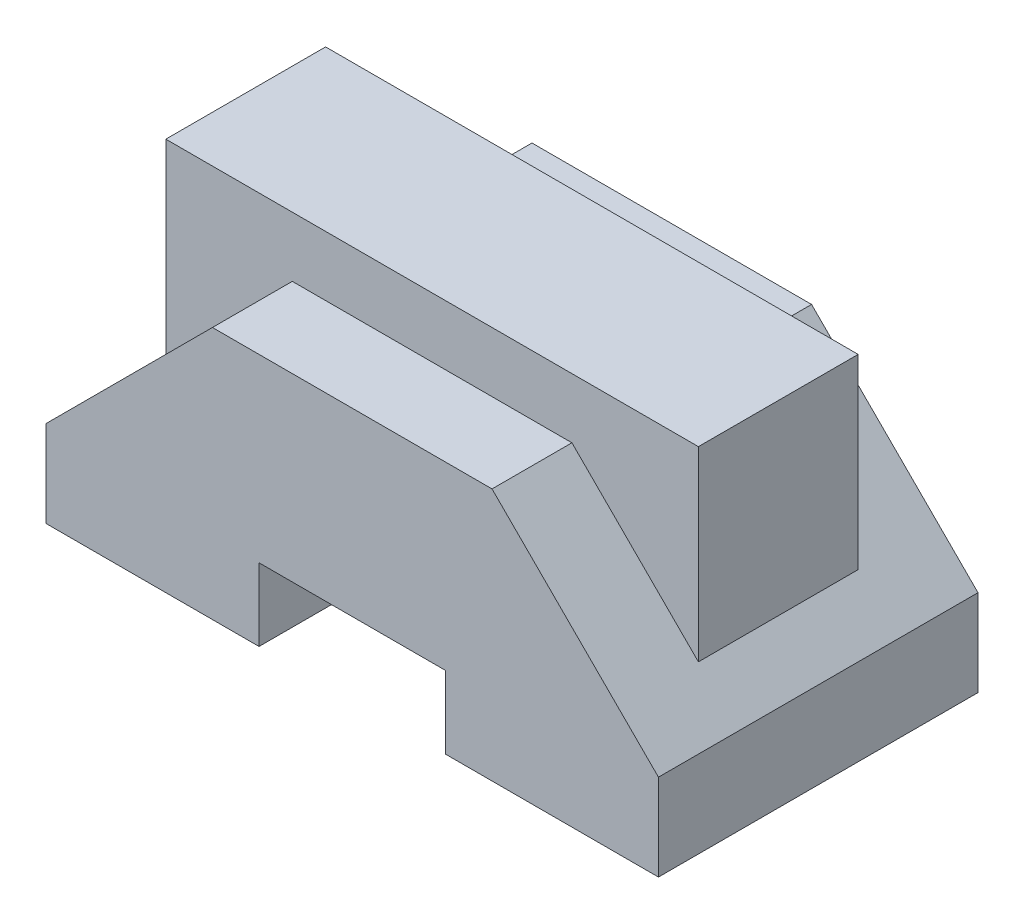
ISO-10303-21;
HEADER;
FILE_DESCRIPTION(('STEP AP214'),'2;1');
FILE_NAME('part.step','',(''),(''),'','','');
FILE_SCHEMA(('AUTOMOTIVE_DESIGN { 1 0 10303 214 1 1 1 1 }'));
ENDSEC;
DATA;
#1=APPLICATION_CONTEXT('core data for automotive mechanical design processes');
#2=APPLICATION_PROTOCOL_DEFINITION('international standard','automotive_design',2000,#1);
#3=PRODUCT_CONTEXT('',#1,'mechanical');
#4=PRODUCT('Part','Part','',(#3));
#5=PRODUCT_RELATED_PRODUCT_CATEGORY('part','',(#4));
#6=PRODUCT_DEFINITION_FORMATION('','',#4);
#7=PRODUCT_DEFINITION_CONTEXT('part definition',#1,'design');
#8=PRODUCT_DEFINITION('design','',#6,#7);
#9=PRODUCT_DEFINITION_SHAPE('','',#8);
#10=(LENGTH_UNIT() NAMED_UNIT(*) SI_UNIT(.MILLI.,.METRE.));
#11=(NAMED_UNIT(*) PLANE_ANGLE_UNIT() SI_UNIT($,.RADIAN.));
#12=(NAMED_UNIT(*) SI_UNIT($,.STERADIAN.) SOLID_ANGLE_UNIT());
#13=UNCERTAINTY_MEASURE_WITH_UNIT(LENGTH_MEASURE(1.E-05),#10,'distance_accuracy_value','');
#14=(GEOMETRIC_REPRESENTATION_CONTEXT(3) GLOBAL_UNCERTAINTY_ASSIGNED_CONTEXT((#13)) GLOBAL_UNIT_ASSIGNED_CONTEXT((#10,
#11,#12)) REPRESENTATION_CONTEXT('',''));
#15=CARTESIAN_POINT('',(0.,0.,0.));
#16=DIRECTION('',(0.,0.,1.));
#17=DIRECTION('',(1.,0.,0.));
#18=AXIS2_PLACEMENT_3D('',#15,#16,#17);
#19=CARTESIAN_POINT('',(0.,38.,24.));
#20=DIRECTION('',(0.,-1.,0.));
#21=DIRECTION('',(0.,0.,-1.));
#22=AXIS2_PLACEMENT_3D('',#19,#20,#21);
#23=PLANE('',#22);
#24=DIRECTION('',(0.,0.,-1.));
#25=VECTOR('',#24,1.);
#26=CARTESIAN_POINT('',(21.,38.,24.));
#27=LINE('',#26,#25);
#28=CARTESIAN_POINT('',(21.,38.,24.));
#29=VERTEX_POINT('',#28);
#30=CARTESIAN_POINT('',(21.,38.,12.));
#31=VERTEX_POINT('',#30);
#32=EDGE_CURVE('E241',#29,#31,#27,.T.);
#33=ORIENTED_EDGE('',*,*,#32,.T.);
#34=DIRECTION('',(-1.,0.,0.));
#35=VECTOR('',#34,1.);
#36=CARTESIAN_POINT('',(0.,38.,12.));
#37=LINE('',#36,#35);
#38=CARTESIAN_POINT('',(-21.,38.,12.));
#39=VERTEX_POINT('',#38);
#40=EDGE_CURVE('E178',#31,#39,#37,.T.);
#41=ORIENTED_EDGE('',*,*,#40,.T.);
#42=DIRECTION('',(0.,0.,-1.));
#43=VECTOR('',#42,1.);
#44=CARTESIAN_POINT('',(-21.,38.,24.));
#45=LINE('',#44,#43);
#46=CARTESIAN_POINT('',(-21.,38.,24.));
#47=VERTEX_POINT('',#46);
#48=EDGE_CURVE('E237',#47,#39,#45,.T.);
#49=ORIENTED_EDGE('',*,*,#48,.F.);
#50=DIRECTION('',(-1.,0.,0.));
#51=VECTOR('',#50,1.);
#52=CARTESIAN_POINT('',(0.,38.,24.));
#53=LINE('',#52,#51);
#54=EDGE_CURVE('E200',#29,#47,#53,.T.);
#55=ORIENTED_EDGE('',*,*,#54,.F.);
#56=EDGE_LOOP('',(#33,#41,#49,#55));
#57=FACE_BOUND('',#56,.T.);
#58=ADVANCED_FACE('F33',(#57),#23,.F.);
#59=CARTESIAN_POINT('',(0.,0.,24.));
#60=DIRECTION('',(0.,-1.,0.));
#61=DIRECTION('',(1.,0.,0.));
#62=AXIS2_PLACEMENT_3D('',#59,#60,#61);
#63=PLANE('',#62);
#64=DIRECTION('',(-1.,0.,0.));
#65=VECTOR('',#64,1.);
#66=CARTESIAN_POINT('',(0.,0.,-24.));
#67=LINE('',#66,#65);
#68=CARTESIAN_POINT('',(-14.,0.,-24.));
#69=VERTEX_POINT('',#68);
#70=CARTESIAN_POINT('',(-46.,0.,-24.));
#71=VERTEX_POINT('',#70);
#72=EDGE_CURVE('E182',#69,#71,#67,.T.);
#73=ORIENTED_EDGE('',*,*,#72,.F.);
#74=DIRECTION('',(0.,0.,-1.));
#75=VECTOR('',#74,1.);
#76=CARTESIAN_POINT('',(-14.,0.,24.));
#77=LINE('',#76,#75);
#78=CARTESIAN_POINT('',(-14.,0.,24.));
#79=VERTEX_POINT('',#78);
#80=EDGE_CURVE('E258',#79,#69,#77,.T.);
#81=ORIENTED_EDGE('',*,*,#80,.F.);
#82=DIRECTION('',(-1.,0.,0.));
#83=VECTOR('',#82,1.);
#84=CARTESIAN_POINT('',(0.,0.,24.));
#85=LINE('',#84,#83);
#86=CARTESIAN_POINT('',(-46.,0.,24.));
#87=VERTEX_POINT('',#86);
#88=EDGE_CURVE('E183',#79,#87,#85,.T.);
#89=ORIENTED_EDGE('',*,*,#88,.T.);
#90=DIRECTION('',(0.,0.,-1.));
#91=VECTOR('',#90,1.);
#92=CARTESIAN_POINT('',(-46.,0.,24.));
#93=LINE('',#92,#91);
#94=EDGE_CURVE('E208',#87,#71,#93,.T.);
#95=ORIENTED_EDGE('',*,*,#94,.T.);
#96=EDGE_LOOP('',(#73,#81,#89,#95));
#97=FACE_BOUND('',#96,.T.);
#98=ADVANCED_FACE('F35',(#97),#63,.T.);
#99=CARTESIAN_POINT('',(-14.,0.,24.));
#100=DIRECTION('',(1.,0.,0.));
#101=DIRECTION('',(0.,1.,0.));
#102=AXIS2_PLACEMENT_3D('',#99,#100,#101);
#103=PLANE('',#102);
#104=DIRECTION('',(0.,-1.,0.));
#105=VECTOR('',#104,1.);
#106=CARTESIAN_POINT('',(-14.,0.,-24.));
#107=LINE('',#106,#105);
#108=CARTESIAN_POINT('',(-14.,10.8912241515163,-24.));
#109=VERTEX_POINT('',#108);
#110=EDGE_CURVE('E211',#109,#69,#107,.T.);
#111=ORIENTED_EDGE('',*,*,#110,.F.);
#112=DIRECTION('',(0.,0.,-1.));
#113=VECTOR('',#112,1.);
#114=CARTESIAN_POINT('',(-14.,10.8912241515163,24.));
#115=LINE('',#114,#113);
#116=CARTESIAN_POINT('',(-14.,10.8912241515163,24.));
#117=VERTEX_POINT('',#116);
#118=EDGE_CURVE('E256',#117,#109,#115,.T.);
#119=ORIENTED_EDGE('',*,*,#118,.F.);
#120=DIRECTION('',(0.,-1.,0.));
#121=VECTOR('',#120,1.);
#122=CARTESIAN_POINT('',(-14.,0.,24.));
#123=LINE('',#122,#121);
#124=EDGE_CURVE('E186',#117,#79,#123,.T.);
#125=ORIENTED_EDGE('',*,*,#124,.T.);
#126=ORIENTED_EDGE('',*,*,#80,.T.);
#127=EDGE_LOOP('',(#111,#119,#125,#126));
#128=FACE_BOUND('',#127,.T.);
#129=ADVANCED_FACE('F306',(#128),#103,.T.);
#130=CARTESIAN_POINT('',(0.,10.8912241515163,24.));
#131=DIRECTION('',(0.,1.,0.));
#132=DIRECTION('',(0.,0.,1.));
#133=AXIS2_PLACEMENT_3D('',#130,#131,#132);
#134=PLANE('',#133);
#135=DIRECTION('',(1.,0.,0.));
#136=VECTOR('',#135,1.);
#137=CARTESIAN_POINT('',(0.,10.8912241515163,-24.));
#138=LINE('',#137,#136);
#139=CARTESIAN_POINT('',(14.,10.8912241515163,-24.));
#140=VERTEX_POINT('',#139);
#141=EDGE_CURVE('E214',#109,#140,#138,.T.);
#142=ORIENTED_EDGE('',*,*,#141,.T.);
#143=DIRECTION('',(0.,0.,-1.));
#144=VECTOR('',#143,1.);
#145=CARTESIAN_POINT('',(14.,10.8912241515163,24.));
#146=LINE('',#145,#144);
#147=CARTESIAN_POINT('',(14.,10.8912241515163,24.));
#148=VERTEX_POINT('',#147);
#149=EDGE_CURVE('E253',#148,#140,#146,.T.);
#150=ORIENTED_EDGE('',*,*,#149,.F.);
#151=DIRECTION('',(1.,0.,0.));
#152=VECTOR('',#151,1.);
#153=CARTESIAN_POINT('',(0.,10.8912241515163,24.));
#154=LINE('',#153,#152);
#155=EDGE_CURVE('E190',#117,#148,#154,.T.);
#156=ORIENTED_EDGE('',*,*,#155,.F.);
#157=ORIENTED_EDGE('',*,*,#118,.T.);
#158=EDGE_LOOP('',(#142,#150,#156,#157));
#159=FACE_BOUND('',#158,.T.);
#160=ADVANCED_FACE('F311',(#159),#134,.F.);
#161=CARTESIAN_POINT('',(14.,0.,24.));
#162=DIRECTION('',(1.,0.,0.));
#163=DIRECTION('',(0.,1.,0.));
#164=AXIS2_PLACEMENT_3D('',#161,#162,#163);
#165=PLANE('',#164);
#166=DIRECTION('',(0.,-1.,0.));
#167=VECTOR('',#166,1.);
#168=CARTESIAN_POINT('',(14.,0.,-24.));
#169=LINE('',#168,#167);
#170=CARTESIAN_POINT('',(14.,0.,-24.));
#171=VERTEX_POINT('',#170);
#172=EDGE_CURVE('E216',#140,#171,#169,.T.);
#173=ORIENTED_EDGE('',*,*,#172,.T.);
#174=DIRECTION('',(0.,0.,-1.));
#175=VECTOR('',#174,1.);
#176=CARTESIAN_POINT('',(14.,0.,24.));
#177=LINE('',#176,#175);
#178=CARTESIAN_POINT('',(14.,0.,24.));
#179=VERTEX_POINT('',#178);
#180=EDGE_CURVE('E250',#179,#171,#177,.T.);
#181=ORIENTED_EDGE('',*,*,#180,.F.);
#182=DIRECTION('',(0.,-1.,0.));
#183=VECTOR('',#182,1.);
#184=CARTESIAN_POINT('',(14.,0.,24.));
#185=LINE('',#184,#183);
#186=EDGE_CURVE('E192',#148,#179,#185,.T.);
#187=ORIENTED_EDGE('',*,*,#186,.F.);
#188=ORIENTED_EDGE('',*,*,#149,.T.);
#189=EDGE_LOOP('',(#173,#181,#187,#188));
#190=FACE_BOUND('',#189,.T.);
#191=ADVANCED_FACE('F317',(#190),#165,.F.);
#192=CARTESIAN_POINT('',(0.,0.,24.));
#193=DIRECTION('',(0.,1.,0.));
#194=DIRECTION('',(-1.,0.,0.));
#195=AXIS2_PLACEMENT_3D('',#192,#193,#194);
#196=PLANE('',#195);
#197=DIRECTION('',(1.,0.,0.));
#198=VECTOR('',#197,1.);
#199=CARTESIAN_POINT('',(0.,0.,-24.));
#200=LINE('',#199,#198);
#201=CARTESIAN_POINT('',(46.,0.,-24.));
#202=VERTEX_POINT('',#201);
#203=EDGE_CURVE('E218',#171,#202,#200,.T.);
#204=ORIENTED_EDGE('',*,*,#203,.T.);
#205=DIRECTION('',(0.,0.,-1.));
#206=VECTOR('',#205,1.);
#207=CARTESIAN_POINT('',(46.,0.,24.));
#208=LINE('',#207,#206);
#209=CARTESIAN_POINT('',(46.,0.,24.));
#210=VERTEX_POINT('',#209);
#211=EDGE_CURVE('E247',#210,#202,#208,.T.);
#212=ORIENTED_EDGE('',*,*,#211,.F.);
#213=DIRECTION('',(1.,0.,0.));
#214=VECTOR('',#213,1.);
#215=CARTESIAN_POINT('',(0.,0.,24.));
#216=LINE('',#215,#214);
#217=EDGE_CURVE('E194',#179,#210,#216,.T.);
#218=ORIENTED_EDGE('',*,*,#217,.F.);
#219=ORIENTED_EDGE('',*,*,#180,.T.);
#220=EDGE_LOOP('',(#204,#212,#218,#219));
#221=FACE_BOUND('',#220,.T.);
#222=ADVANCED_FACE('F320',(#221),#196,.F.);
#223=CARTESIAN_POINT('',(46.,0.,24.));
#224=DIRECTION('',(-1.,0.,0.));
#225=DIRECTION('',(0.,-1.,0.));
#226=AXIS2_PLACEMENT_3D('',#223,#224,#225);
#227=PLANE('',#226);
#228=DIRECTION('',(0.,1.,0.));
#229=VECTOR('',#228,1.);
#230=CARTESIAN_POINT('',(46.,0.,-24.));
#231=LINE('',#230,#229);
#232=CARTESIAN_POINT('',(46.,13.,-24.));
#233=VERTEX_POINT('',#232);
#234=EDGE_CURVE('E220',#202,#233,#231,.T.);
#235=ORIENTED_EDGE('',*,*,#234,.T.);
#236=DIRECTION('',(0.,0.,-1.));
#237=VECTOR('',#236,1.);
#238=CARTESIAN_POINT('',(46.,13.,24.));
#239=LINE('',#238,#237);
#240=CARTESIAN_POINT('',(46.,13.,24.));
#241=VERTEX_POINT('',#240);
#242=EDGE_CURVE('E244',#241,#233,#239,.T.);
#243=ORIENTED_EDGE('',*,*,#242,.F.);
#244=DIRECTION('',(0.,1.,0.));
#245=VECTOR('',#244,1.);
#246=CARTESIAN_POINT('',(46.,0.,24.));
#247=LINE('',#246,#245);
#248=EDGE_CURVE('E196',#210,#241,#247,.T.);
#249=ORIENTED_EDGE('',*,*,#248,.F.);
#250=ORIENTED_EDGE('',*,*,#211,.T.);
#251=EDGE_LOOP('',(#235,#243,#249,#250));
#252=FACE_BOUND('',#251,.T.);
#253=ADVANCED_FACE('F321',(#252),#227,.F.);
#254=CARTESIAN_POINT('',(29.5,29.5,24.));
#255=DIRECTION('',(-0.707106781186547,-0.707106781186548,0.));
#256=DIRECTION('',(0.707106781186548,-0.707106781186547,0.));
#257=AXIS2_PLACEMENT_3D('',#254,#255,#256);
#258=PLANE('',#257);
#259=DIRECTION('',(0.,0.,1.));
#260=VECTOR('',#259,1.);
#261=CARTESIAN_POINT('',(40.,19.,24.));
#262=LINE('',#261,#260);
#263=CARTESIAN_POINT('',(40.,19.,-12.));
#264=VERTEX_POINT('',#263);
#265=CARTESIAN_POINT('',(40.,19.,12.));
#266=VERTEX_POINT('',#265);
#267=EDGE_CURVE('E11',#264,#266,#262,.T.);
#268=ORIENTED_EDGE('',*,*,#267,.T.);
#269=DIRECTION('',(-0.707106781186548,0.707106781186547,0.));
#270=VECTOR('',#269,1.);
#271=CARTESIAN_POINT('',(29.5,29.5,12.));
#272=LINE('',#271,#270);
#273=EDGE_CURVE('E180',#266,#31,#272,.T.);
#274=ORIENTED_EDGE('',*,*,#273,.T.);
#275=ORIENTED_EDGE('',*,*,#32,.F.);
#276=DIRECTION('',(-0.707106781186548,0.707106781186547,0.));
#277=VECTOR('',#276,1.);
#278=CARTESIAN_POINT('',(29.5,29.5,24.));
#279=LINE('',#278,#277);
#280=EDGE_CURVE('E198',#241,#29,#279,.T.);
#281=ORIENTED_EDGE('',*,*,#280,.F.);
#282=ORIENTED_EDGE('',*,*,#242,.T.);
#283=DIRECTION('',(-0.707106781186548,0.707106781186547,0.));
#284=VECTOR('',#283,1.);
#285=CARTESIAN_POINT('',(29.5,29.5,-24.));
#286=LINE('',#285,#284);
#287=CARTESIAN_POINT('',(21.,38.,-24.));
#288=VERTEX_POINT('',#287);
#289=EDGE_CURVE('E222',#233,#288,#286,.T.);
#290=ORIENTED_EDGE('',*,*,#289,.T.);
#291=CARTESIAN_POINT('',(21.,38.,-12.));
#292=VERTEX_POINT('',#291);
#293=EDGE_CURVE('E240',#292,#288,#27,.T.);
#294=ORIENTED_EDGE('',*,*,#293,.F.);
#295=DIRECTION('',(0.707106781186548,-0.707106781186547,0.));
#296=VECTOR('',#295,1.);
#297=CARTESIAN_POINT('',(29.5,29.5,-12.));
#298=LINE('',#297,#296);
#299=EDGE_CURVE('E51',#292,#264,#298,.T.);
#300=ORIENTED_EDGE('',*,*,#299,.T.);
#301=EDGE_LOOP('',(#268,#274,#275,#281,#282,#290,#294,#300));
#302=FACE_BOUND('',#301,.T.);
#303=ADVANCED_FACE('F275',(#302),#258,.F.);
#304=CARTESIAN_POINT('',(-21.,38.,-12.));
#305=VERTEX_POINT('',#304);
#306=CARTESIAN_POINT('',(-21.,38.,-24.));
#307=VERTEX_POINT('',#306);
#308=EDGE_CURVE('E236',#305,#307,#45,.T.);
#309=ORIENTED_EDGE('',*,*,#308,.F.);
#310=DIRECTION('',(1.,0.,0.));
#311=VECTOR('',#310,1.);
#312=CARTESIAN_POINT('',(0.,38.,-12.));
#313=LINE('',#312,#311);
#314=EDGE_CURVE('E172',#305,#292,#313,.T.);
#315=ORIENTED_EDGE('',*,*,#314,.T.);
#316=ORIENTED_EDGE('',*,*,#293,.T.);
#317=DIRECTION('',(-1.,0.,0.));
#318=VECTOR('',#317,1.);
#319=CARTESIAN_POINT('',(0.,38.,-24.));
#320=LINE('',#319,#318);
#321=EDGE_CURVE('E225',#288,#307,#320,.T.);
#322=ORIENTED_EDGE('',*,*,#321,.T.);
#323=EDGE_LOOP('',(#309,#315,#316,#322));
#324=FACE_BOUND('',#323,.T.);
#325=ADVANCED_FACE('F296',(#324),#23,.F.);
#326=CARTESIAN_POINT('',(-29.5,29.5,24.));
#327=DIRECTION('',(-0.707106781186547,0.707106781186548,0.));
#328=DIRECTION('',(-0.707106781186548,-0.707106781186547,0.));
#329=AXIS2_PLACEMENT_3D('',#326,#327,#328);
#330=PLANE('',#329);
#331=DIRECTION('',(0.707106781186548,0.707106781186547,0.));
#332=VECTOR('',#331,1.);
#333=CARTESIAN_POINT('',(-29.5,29.5,12.));
#334=LINE('',#333,#332);
#335=CARTESIAN_POINT('',(-40.,19.,12.));
#336=VERTEX_POINT('',#335);
#337=EDGE_CURVE('E41',#336,#39,#334,.T.);
#338=ORIENTED_EDGE('',*,*,#337,.F.);
#339=DIRECTION('',(0.,0.,1.));
#340=VECTOR('',#339,1.);
#341=CARTESIAN_POINT('',(-40.,19.,24.));
#342=LINE('',#341,#340);
#343=CARTESIAN_POINT('',(-40.,19.,-12.));
#344=VERTEX_POINT('',#343);
#345=EDGE_CURVE('E262',#344,#336,#342,.T.);
#346=ORIENTED_EDGE('',*,*,#345,.F.);
#347=DIRECTION('',(-0.707106781186548,-0.707106781186547,0.));
#348=VECTOR('',#347,1.);
#349=CARTESIAN_POINT('',(-29.5,29.5,-12.));
#350=LINE('',#349,#348);
#351=EDGE_CURVE('E260',#305,#344,#350,.T.);
#352=ORIENTED_EDGE('',*,*,#351,.F.);
#353=ORIENTED_EDGE('',*,*,#308,.T.);
#354=DIRECTION('',(0.707106781186548,0.707106781186547,0.));
#355=VECTOR('',#354,1.);
#356=CARTESIAN_POINT('',(-29.5,29.5,-24.));
#357=LINE('',#356,#355);
#358=CARTESIAN_POINT('',(-46.,13.,-24.));
#359=VERTEX_POINT('',#358);
#360=EDGE_CURVE('E228',#359,#307,#357,.T.);
#361=ORIENTED_EDGE('',*,*,#360,.F.);
#362=DIRECTION('',(0.,0.,-1.));
#363=VECTOR('',#362,1.);
#364=CARTESIAN_POINT('',(-46.,13.,24.));
#365=LINE('',#364,#363);
#366=CARTESIAN_POINT('',(-46.,13.,24.));
#367=VERTEX_POINT('',#366);
#368=EDGE_CURVE('E234',#367,#359,#365,.T.);
#369=ORIENTED_EDGE('',*,*,#368,.F.);
#370=DIRECTION('',(0.707106781186548,0.707106781186547,0.));
#371=VECTOR('',#370,1.);
#372=CARTESIAN_POINT('',(-29.5,29.5,24.));
#373=LINE('',#372,#371);
#374=EDGE_CURVE('E202',#367,#47,#373,.T.);
#375=ORIENTED_EDGE('',*,*,#374,.T.);
#376=ORIENTED_EDGE('',*,*,#48,.T.);
#377=EDGE_LOOP('',(#338,#346,#352,#353,#361,#369,#375,#376));
#378=FACE_BOUND('',#377,.T.);
#379=ADVANCED_FACE('F270',(#378),#330,.T.);
#380=CARTESIAN_POINT('',(-46.,0.,24.));
#381=DIRECTION('',(-1.,0.,0.));
#382=DIRECTION('',(0.,-1.,0.));
#383=AXIS2_PLACEMENT_3D('',#380,#381,#382);
#384=PLANE('',#383);
#385=DIRECTION('',(0.,1.,0.));
#386=VECTOR('',#385,1.);
#387=CARTESIAN_POINT('',(-46.,0.,-24.));
#388=LINE('',#387,#386);
#389=EDGE_CURVE('E187',#71,#359,#388,.T.);
#390=ORIENTED_EDGE('',*,*,#389,.F.);
#391=ORIENTED_EDGE('',*,*,#94,.F.);
#392=DIRECTION('',(0.,1.,0.));
#393=VECTOR('',#392,1.);
#394=CARTESIAN_POINT('',(-46.,0.,24.));
#395=LINE('',#394,#393);
#396=EDGE_CURVE('E205',#87,#367,#395,.T.);
#397=ORIENTED_EDGE('',*,*,#396,.T.);
#398=ORIENTED_EDGE('',*,*,#368,.T.);
#399=EDGE_LOOP('',(#390,#391,#397,#398));
#400=FACE_BOUND('',#399,.T.);
#401=ADVANCED_FACE('F301',(#400),#384,.T.);
#402=CARTESIAN_POINT('',(0.,0.,24.));
#403=DIRECTION('',(0.,0.,1.));
#404=DIRECTION('',(1.,0.,0.));
#405=AXIS2_PLACEMENT_3D('',#402,#403,#404);
#406=PLANE('',#405);
#407=ORIENTED_EDGE('',*,*,#88,.F.);
#408=ORIENTED_EDGE('',*,*,#124,.F.);
#409=ORIENTED_EDGE('',*,*,#155,.T.);
#410=ORIENTED_EDGE('',*,*,#186,.T.);
#411=ORIENTED_EDGE('',*,*,#217,.T.);
#412=ORIENTED_EDGE('',*,*,#248,.T.);
#413=ORIENTED_EDGE('',*,*,#280,.T.);
#414=ORIENTED_EDGE('',*,*,#54,.T.);
#415=ORIENTED_EDGE('',*,*,#374,.F.);
#416=ORIENTED_EDGE('',*,*,#396,.F.);
#417=EDGE_LOOP('',(#407,#408,#409,#410,#411,#412,#413,#414,#415,#416));
#418=FACE_BOUND('',#417,.T.);
#419=ADVANCED_FACE('F282',(#418),#406,.T.);
#420=CARTESIAN_POINT('',(0.,0.,-24.));
#421=DIRECTION('',(0.,0.,1.));
#422=DIRECTION('',(1.,0.,0.));
#423=AXIS2_PLACEMENT_3D('',#420,#421,#422);
#424=PLANE('',#423);
#425=ORIENTED_EDGE('',*,*,#72,.T.);
#426=ORIENTED_EDGE('',*,*,#389,.T.);
#427=ORIENTED_EDGE('',*,*,#360,.T.);
#428=ORIENTED_EDGE('',*,*,#321,.F.);
#429=ORIENTED_EDGE('',*,*,#289,.F.);
#430=ORIENTED_EDGE('',*,*,#234,.F.);
#431=ORIENTED_EDGE('',*,*,#203,.F.);
#432=ORIENTED_EDGE('',*,*,#172,.F.);
#433=ORIENTED_EDGE('',*,*,#141,.F.);
#434=ORIENTED_EDGE('',*,*,#110,.T.);
#435=EDGE_LOOP('',(#425,#426,#427,#428,#429,#430,#431,#432,#433,#434));
#436=FACE_BOUND('',#435,.T.);
#437=ADVANCED_FACE('F291',(#436),#424,.F.);
#438=CARTESIAN_POINT('',(40.,11.,12.));
#439=DIRECTION('',(1.,0.,0.));
#440=DIRECTION('',(0.,0.,-1.));
#441=AXIS2_PLACEMENT_3D('',#438,#439,#440);
#442=PLANE('',#441);
#443=ORIENTED_EDGE('',*,*,#267,.F.);
#444=DIRECTION('',(0.,1.,0.));
#445=VECTOR('',#444,1.);
#446=CARTESIAN_POINT('',(40.,11.,-12.));
#447=LINE('',#446,#445);
#448=CARTESIAN_POINT('',(40.,47.,-12.));
#449=VERTEX_POINT('',#448);
#450=EDGE_CURVE('E143',#264,#449,#447,.T.);
#451=ORIENTED_EDGE('',*,*,#450,.T.);
#452=DIRECTION('',(0.,0.,-1.));
#453=VECTOR('',#452,1.);
#454=CARTESIAN_POINT('',(40.,47.,12.));
#455=LINE('',#454,#453);
#456=CARTESIAN_POINT('',(40.,47.,12.));
#457=VERTEX_POINT('',#456);
#458=EDGE_CURVE('E148',#457,#449,#455,.T.);
#459=ORIENTED_EDGE('',*,*,#458,.F.);
#460=DIRECTION('',(0.,1.,0.));
#461=VECTOR('',#460,1.);
#462=CARTESIAN_POINT('',(40.,11.,12.));
#463=LINE('',#462,#461);
#464=EDGE_CURVE('E170',#266,#457,#463,.T.);
#465=ORIENTED_EDGE('',*,*,#464,.F.);
#466=EDGE_LOOP('',(#443,#451,#459,#465));
#467=FACE_BOUND('',#466,.T.);
#468=ADVANCED_FACE('F145',(#467),#442,.T.);
#469=CARTESIAN_POINT('',(-40.,11.,12.));
#470=DIRECTION('',(0.,0.,1.));
#471=DIRECTION('',(1.,0.,0.));
#472=AXIS2_PLACEMENT_3D('',#469,#470,#471);
#473=PLANE('',#472);
#474=ORIENTED_EDGE('',*,*,#273,.F.);
#475=ORIENTED_EDGE('',*,*,#464,.T.);
#476=DIRECTION('',(1.,0.,0.));
#477=VECTOR('',#476,1.);
#478=CARTESIAN_POINT('',(-40.,47.,12.));
#479=LINE('',#478,#477);
#480=CARTESIAN_POINT('',(-40.,47.,12.));
#481=VERTEX_POINT('',#480);
#482=EDGE_CURVE('E152',#481,#457,#479,.T.);
#483=ORIENTED_EDGE('',*,*,#482,.F.);
#484=DIRECTION('',(0.,1.,0.));
#485=VECTOR('',#484,1.);
#486=CARTESIAN_POINT('',(-40.,11.,12.));
#487=LINE('',#486,#485);
#488=EDGE_CURVE('E173',#336,#481,#487,.T.);
#489=ORIENTED_EDGE('',*,*,#488,.F.);
#490=ORIENTED_EDGE('',*,*,#337,.T.);
#491=ORIENTED_EDGE('',*,*,#40,.F.);
#492=EDGE_LOOP('',(#474,#475,#483,#489,#490,#491));
#493=FACE_BOUND('',#492,.T.);
#494=ADVANCED_FACE('F268',(#493),#473,.T.);
#495=CARTESIAN_POINT('',(-40.,11.,-12.));
#496=DIRECTION('',(0.,0.,-1.));
#497=DIRECTION('',(-1.,0.,0.));
#498=AXIS2_PLACEMENT_3D('',#495,#496,#497);
#499=PLANE('',#498);
#500=ORIENTED_EDGE('',*,*,#299,.F.);
#501=ORIENTED_EDGE('',*,*,#314,.F.);
#502=ORIENTED_EDGE('',*,*,#351,.T.);
#503=DIRECTION('',(0.,1.,0.));
#504=VECTOR('',#503,1.);
#505=CARTESIAN_POINT('',(-40.,11.,-12.));
#506=LINE('',#505,#504);
#507=CARTESIAN_POINT('',(-40.,47.,-12.));
#508=VERTEX_POINT('',#507);
#509=EDGE_CURVE('E151',#344,#508,#506,.T.);
#510=ORIENTED_EDGE('',*,*,#509,.T.);
#511=DIRECTION('',(-1.,0.,0.));
#512=VECTOR('',#511,1.);
#513=CARTESIAN_POINT('',(-40.,47.,-12.));
#514=LINE('',#513,#512);
#515=EDGE_CURVE('E155',#449,#508,#514,.T.);
#516=ORIENTED_EDGE('',*,*,#515,.F.);
#517=ORIENTED_EDGE('',*,*,#450,.F.);
#518=EDGE_LOOP('',(#500,#501,#502,#510,#516,#517));
#519=FACE_BOUND('',#518,.T.);
#520=ADVANCED_FACE('F156',(#519),#499,.T.);
#521=CARTESIAN_POINT('',(-40.,11.,12.));
#522=DIRECTION('',(-1.,0.,0.));
#523=DIRECTION('',(0.,0.,1.));
#524=AXIS2_PLACEMENT_3D('',#521,#522,#523);
#525=PLANE('',#524);
#526=ORIENTED_EDGE('',*,*,#509,.F.);
#527=ORIENTED_EDGE('',*,*,#345,.T.);
#528=ORIENTED_EDGE('',*,*,#488,.T.);
#529=DIRECTION('',(0.,0.,1.));
#530=VECTOR('',#529,1.);
#531=CARTESIAN_POINT('',(-40.,47.,12.));
#532=LINE('',#531,#530);
#533=EDGE_CURVE('E162',#508,#481,#532,.T.);
#534=ORIENTED_EDGE('',*,*,#533,.F.);
#535=EDGE_LOOP('',(#526,#527,#528,#534));
#536=FACE_BOUND('',#535,.T.);
#537=ADVANCED_FACE('F273',(#536),#525,.T.);
#538=CARTESIAN_POINT('',(0.,47.,0.));
#539=DIRECTION('',(0.,-1.,0.));
#540=DIRECTION('',(0.,0.,-1.));
#541=AXIS2_PLACEMENT_3D('',#538,#539,#540);
#542=PLANE('',#541);
#543=ORIENTED_EDGE('',*,*,#458,.T.);
#544=ORIENTED_EDGE('',*,*,#515,.T.);
#545=ORIENTED_EDGE('',*,*,#533,.T.);
#546=ORIENTED_EDGE('',*,*,#482,.T.);
#547=EDGE_LOOP('',(#543,#544,#545,#546));
#548=FACE_BOUND('',#547,.T.);
#549=ADVANCED_FACE('F164',(#548),#542,.F.);
#550=CLOSED_SHELL('',(#58,#98,#129,#160,#191,#222,#253,#303,#325,#379,#401,#419,#437,#468,#494,
#520,#537,#549));
#551=MANIFOLD_SOLID_BREP('B2',#550);
#552=ADVANCED_BREP_SHAPE_REPRESENTATION('',(#18,#551),#14);
#553=SHAPE_DEFINITION_REPRESENTATION(#9,#552);
ENDSEC;
END-ISO-10303-21;
